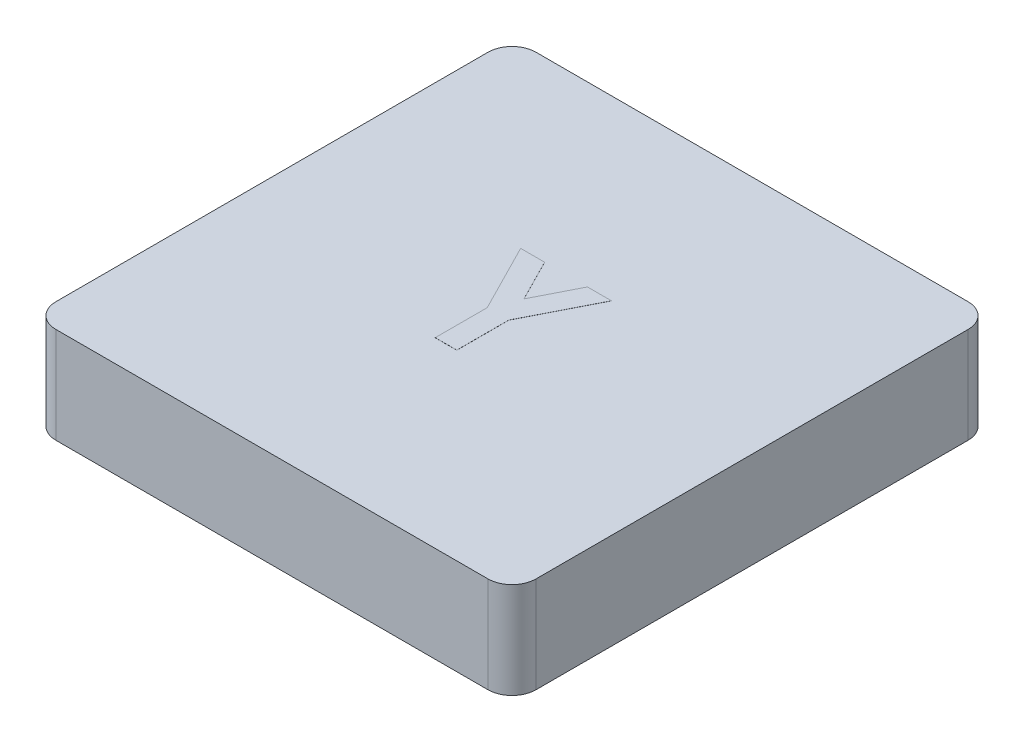
ISO-10303-21;
HEADER;
FILE_DESCRIPTION(('STEP AP214'),'2;1');
FILE_NAME('part.step','',(''),(''),'','','');
FILE_SCHEMA(('AUTOMOTIVE_DESIGN { 1 0 10303 214 1 1 1 1 }'));
ENDSEC;
DATA;
#1=APPLICATION_CONTEXT('core data for automotive mechanical design processes');
#2=APPLICATION_PROTOCOL_DEFINITION('international standard','automotive_design',2000,#1);
#3=PRODUCT_CONTEXT('',#1,'mechanical');
#4=PRODUCT('Part','Part','',(#3));
#5=PRODUCT_RELATED_PRODUCT_CATEGORY('part','',(#4));
#6=PRODUCT_DEFINITION_FORMATION('','',#4);
#7=PRODUCT_DEFINITION_CONTEXT('part definition',#1,'design');
#8=PRODUCT_DEFINITION('design','',#6,#7);
#9=PRODUCT_DEFINITION_SHAPE('','',#8);
#10=(LENGTH_UNIT() NAMED_UNIT(*) SI_UNIT(.MILLI.,.METRE.));
#11=(NAMED_UNIT(*) PLANE_ANGLE_UNIT() SI_UNIT($,.RADIAN.));
#12=(NAMED_UNIT(*) SI_UNIT($,.STERADIAN.) SOLID_ANGLE_UNIT());
#13=UNCERTAINTY_MEASURE_WITH_UNIT(LENGTH_MEASURE(1.E-05),#10,'distance_accuracy_value','');
#14=(GEOMETRIC_REPRESENTATION_CONTEXT(3) GLOBAL_UNCERTAINTY_ASSIGNED_CONTEXT((#13)) GLOBAL_UNIT_ASSIGNED_CONTEXT((#10,
#11,#12)) REPRESENTATION_CONTEXT('',''));
#15=CARTESIAN_POINT('',(0.,0.,0.));
#16=DIRECTION('',(0.,0.,1.));
#17=DIRECTION('',(1.,0.,0.));
#18=AXIS2_PLACEMENT_3D('',#15,#16,#17);
#19=CARTESIAN_POINT('',(0.,2.54,-12.7));
#20=DIRECTION('',(1.,0.,0.));
#21=DIRECTION('',(0.,0.,-1.));
#22=AXIS2_PLACEMENT_3D('',#19,#20,#21);
#23=PLANE('',#22);
#24=DIRECTION('',(0.,0.,1.));
#25=VECTOR('',#24,1.);
#26=CARTESIAN_POINT('',(0.,2.54,-12.7));
#27=LINE('',#26,#25);
#28=CARTESIAN_POINT('',(0.,2.54,-12.065));
#29=VERTEX_POINT('',#28);
#30=CARTESIAN_POINT('',(0.,2.54,-0.635));
#31=VERTEX_POINT('',#30);
#32=EDGE_CURVE('E294',#29,#31,#27,.T.);
#33=ORIENTED_EDGE('',*,*,#32,.F.);
#34=DIRECTION('',(0.,-1.,0.));
#35=VECTOR('',#34,1.);
#36=CARTESIAN_POINT('',(0.,2.54,-12.065));
#37=LINE('',#36,#35);
#38=CARTESIAN_POINT('',(0.,0.,-12.065));
#39=VERTEX_POINT('',#38);
#40=EDGE_CURVE('E319',#29,#39,#37,.T.);
#41=ORIENTED_EDGE('',*,*,#40,.T.);
#42=DIRECTION('',(0.,0.,1.));
#43=VECTOR('',#42,1.);
#44=CARTESIAN_POINT('',(0.,0.,-12.7));
#45=LINE('',#44,#43);
#46=CARTESIAN_POINT('',(0.,0.,-0.635));
#47=VERTEX_POINT('',#46);
#48=EDGE_CURVE('E274',#39,#47,#45,.T.);
#49=ORIENTED_EDGE('',*,*,#48,.T.);
#50=DIRECTION('',(0.,-1.,0.));
#51=VECTOR('',#50,1.);
#52=CARTESIAN_POINT('',(0.,2.54,-0.635));
#53=LINE('',#52,#51);
#54=EDGE_CURVE('E307',#47,#31,#53,.F.);
#55=ORIENTED_EDGE('',*,*,#54,.T.);
#56=EDGE_LOOP('',(#33,#41,#49,#55));
#57=FACE_BOUND('',#56,.T.);
#58=ADVANCED_FACE('F33',(#57),#23,.F.);
#59=CARTESIAN_POINT('',(0.,2.54,0.));
#60=DIRECTION('',(0.,0.,-1.));
#61=DIRECTION('',(-1.,0.,0.));
#62=AXIS2_PLACEMENT_3D('',#59,#60,#61);
#63=PLANE('',#62);
#64=DIRECTION('',(1.,0.,0.));
#65=VECTOR('',#64,1.);
#66=CARTESIAN_POINT('',(0.,0.,0.));
#67=LINE('',#66,#65);
#68=CARTESIAN_POINT('',(0.635,0.,0.));
#69=VERTEX_POINT('',#68);
#70=CARTESIAN_POINT('',(12.065,0.,0.));
#71=VERTEX_POINT('',#70);
#72=EDGE_CURVE('E310',#69,#71,#67,.T.);
#73=ORIENTED_EDGE('',*,*,#72,.T.);
#74=DIRECTION('',(0.,-1.,0.));
#75=VECTOR('',#74,1.);
#76=CARTESIAN_POINT('',(12.065,2.54,0.));
#77=LINE('',#76,#75);
#78=CARTESIAN_POINT('',(12.065,2.54,0.));
#79=VERTEX_POINT('',#78);
#80=EDGE_CURVE('E41',#71,#79,#77,.F.);
#81=ORIENTED_EDGE('',*,*,#80,.T.);
#82=DIRECTION('',(1.,0.,0.));
#83=VECTOR('',#82,1.);
#84=CARTESIAN_POINT('',(0.,2.54,0.));
#85=LINE('',#84,#83);
#86=CARTESIAN_POINT('',(0.635,2.54,0.));
#87=VERTEX_POINT('',#86);
#88=EDGE_CURVE('E297',#87,#79,#85,.T.);
#89=ORIENTED_EDGE('',*,*,#88,.F.);
#90=DIRECTION('',(0.,-1.,0.));
#91=VECTOR('',#90,1.);
#92=CARTESIAN_POINT('',(0.635,2.54,0.));
#93=LINE('',#92,#91);
#94=EDGE_CURVE('E348',#87,#69,#93,.T.);
#95=ORIENTED_EDGE('',*,*,#94,.T.);
#96=EDGE_LOOP('',(#73,#81,#89,#95));
#97=FACE_BOUND('',#96,.T.);
#98=ADVANCED_FACE('F353',(#97),#63,.F.);
#99=CARTESIAN_POINT('',(12.7,2.54,0.));
#100=DIRECTION('',(-1.,0.,0.));
#101=DIRECTION('',(0.,0.,1.));
#102=AXIS2_PLACEMENT_3D('',#99,#100,#101);
#103=PLANE('',#102);
#104=DIRECTION('',(0.,0.,-1.));
#105=VECTOR('',#104,1.);
#106=CARTESIAN_POINT('',(12.7,0.,0.));
#107=LINE('',#106,#105);
#108=CARTESIAN_POINT('',(12.7,0.,-0.635));
#109=VERTEX_POINT('',#108);
#110=CARTESIAN_POINT('',(12.7,0.,-12.065));
#111=VERTEX_POINT('',#110);
#112=EDGE_CURVE('E313',#109,#111,#107,.T.);
#113=ORIENTED_EDGE('',*,*,#112,.T.);
#114=DIRECTION('',(0.,-1.,0.));
#115=VECTOR('',#114,1.);
#116=CARTESIAN_POINT('',(12.7,2.54,-12.065));
#117=LINE('',#116,#115);
#118=CARTESIAN_POINT('',(12.7,2.54,-12.065));
#119=VERTEX_POINT('',#118);
#120=EDGE_CURVE('E346',#111,#119,#117,.F.);
#121=ORIENTED_EDGE('',*,*,#120,.T.);
#122=DIRECTION('',(0.,0.,-1.));
#123=VECTOR('',#122,1.);
#124=CARTESIAN_POINT('',(12.7,2.54,0.));
#125=LINE('',#124,#123);
#126=CARTESIAN_POINT('',(12.7,2.54,-0.635));
#127=VERTEX_POINT('',#126);
#128=EDGE_CURVE('E301',#127,#119,#125,.T.);
#129=ORIENTED_EDGE('',*,*,#128,.F.);
#130=DIRECTION('',(0.,-1.,0.));
#131=VECTOR('',#130,1.);
#132=CARTESIAN_POINT('',(12.7,2.54,-0.635));
#133=LINE('',#132,#131);
#134=EDGE_CURVE('E343',#127,#109,#133,.T.);
#135=ORIENTED_EDGE('',*,*,#134,.T.);
#136=EDGE_LOOP('',(#113,#121,#129,#135));
#137=FACE_BOUND('',#136,.T.);
#138=ADVANCED_FACE('F366',(#137),#103,.F.);
#139=CARTESIAN_POINT('',(12.7,2.54,-12.7));
#140=DIRECTION('',(0.,0.,1.));
#141=DIRECTION('',(1.,0.,0.));
#142=AXIS2_PLACEMENT_3D('',#139,#140,#141);
#143=PLANE('',#142);
#144=DIRECTION('',(-1.,0.,0.));
#145=VECTOR('',#144,1.);
#146=CARTESIAN_POINT('',(12.7,0.,-12.7));
#147=LINE('',#146,#145);
#148=CARTESIAN_POINT('',(12.065,0.,-12.7));
#149=VERTEX_POINT('',#148);
#150=CARTESIAN_POINT('',(0.634999999999995,0.,-12.7));
#151=VERTEX_POINT('',#150);
#152=EDGE_CURVE('E298',#149,#151,#147,.T.);
#153=ORIENTED_EDGE('',*,*,#152,.T.);
#154=DIRECTION('',(0.,-1.,0.));
#155=VECTOR('',#154,1.);
#156=CARTESIAN_POINT('',(0.634999999999995,2.54,-12.7));
#157=LINE('',#156,#155);
#158=CARTESIAN_POINT('',(0.634999999999995,2.54,-12.7));
#159=VERTEX_POINT('',#158);
#160=EDGE_CURVE('E333',#151,#159,#157,.F.);
#161=ORIENTED_EDGE('',*,*,#160,.T.);
#162=DIRECTION('',(-1.,0.,0.));
#163=VECTOR('',#162,1.);
#164=CARTESIAN_POINT('',(12.7,2.54,-12.7));
#165=LINE('',#164,#163);
#166=CARTESIAN_POINT('',(12.065,2.54,-12.7));
#167=VERTEX_POINT('',#166);
#168=EDGE_CURVE('E304',#167,#159,#165,.T.);
#169=ORIENTED_EDGE('',*,*,#168,.F.);
#170=DIRECTION('',(0.,-1.,0.));
#171=VECTOR('',#170,1.);
#172=CARTESIAN_POINT('',(12.065,2.54,-12.7));
#173=LINE('',#172,#171);
#174=EDGE_CURVE('E330',#167,#149,#173,.T.);
#175=ORIENTED_EDGE('',*,*,#174,.T.);
#176=EDGE_LOOP('',(#153,#161,#169,#175));
#177=FACE_BOUND('',#176,.T.);
#178=ADVANCED_FACE('F378',(#177),#143,.F.);
#179=CARTESIAN_POINT('',(0.,2.54,0.));
#180=DIRECTION('',(0.,1.,0.));
#181=DIRECTION('',(0.,0.,1.));
#182=AXIS2_PLACEMENT_3D('',#179,#180,#181);
#183=PLANE('',#182);
#184=DIRECTION('',(-0.453501133357851,0.,-0.891255699585223));
#185=VECTOR('',#184,1.);
#186=CARTESIAN_POINT('',(5.8436282051282,2.54,-6.20107011217949));
#187=LINE('',#186,#185);
#188=CARTESIAN_POINT('',(5.8436282051282,2.54,-6.20107011217949));
#189=VERTEX_POINT('',#188);
#190=CARTESIAN_POINT('',(4.92776282051282,2.54,-8.001));
#191=VERTEX_POINT('',#190);
#192=EDGE_CURVE('E221',#189,#191,#187,.T.);
#193=ORIENTED_EDGE('',*,*,#192,.T.);
#194=DIRECTION('',(1.,0.,0.));
#195=VECTOR('',#194,1.);
#196=CARTESIAN_POINT('',(4.92776282051282,2.54,-8.001));
#197=LINE('',#196,#195);
#198=CARTESIAN_POINT('',(5.56187239583333,2.54,-8.001));
#199=VERTEX_POINT('',#198);
#200=EDGE_CURVE('E181',#191,#199,#197,.T.);
#201=ORIENTED_EDGE('',*,*,#200,.T.);
#202=DIRECTION('',(0.453513991318912,0.,0.891249156901699));
#203=VECTOR('',#202,1.);
#204=CARTESIAN_POINT('',(5.56187239583333,2.54,-8.001));
#205=LINE('',#204,#203);
#206=CARTESIAN_POINT('',(6.1285641025641,2.54,-6.88733313301282));
#207=VERTEX_POINT('',#206);
#208=EDGE_CURVE('E224',#199,#207,#205,.T.);
#209=ORIENTED_EDGE('',*,*,#208,.T.);
#210=DIRECTION('',(0.453513991318911,0.,-0.8912491569017));
#211=VECTOR('',#210,1.);
#212=CARTESIAN_POINT('',(6.1285641025641,2.54,-6.88733313301282));
#213=LINE('',#212,#211);
#214=CARTESIAN_POINT('',(6.69525580929486,2.54,-8.001));
#215=VERTEX_POINT('',#214);
#216=EDGE_CURVE('E226',#207,#215,#213,.T.);
#217=ORIENTED_EDGE('',*,*,#216,.T.);
#218=DIRECTION('',(1.,0.,0.));
#219=VECTOR('',#218,1.);
#220=CARTESIAN_POINT('',(6.69525580929487,2.54,-8.001));
#221=LINE('',#220,#219);
#222=CARTESIAN_POINT('',(7.32936538461538,2.54,-8.001));
#223=VERTEX_POINT('',#222);
#224=EDGE_CURVE('E228',#215,#223,#221,.T.);
#225=ORIENTED_EDGE('',*,*,#224,.T.);
#226=DIRECTION('',(-0.453501133357852,0.,0.891255699585222));
#227=VECTOR('',#226,1.);
#228=CARTESIAN_POINT('',(7.32936538461538,2.54,-8.001));
#229=LINE('',#228,#227);
#230=CARTESIAN_POINT('',(6.4135,2.54,-6.20107011217949));
#231=VERTEX_POINT('',#230);
#232=EDGE_CURVE('E230',#223,#231,#229,.T.);
#233=ORIENTED_EDGE('',*,*,#232,.T.);
#234=DIRECTION('',(0.,0.,1.));
#235=VECTOR('',#234,1.);
#236=CARTESIAN_POINT('',(6.41349999999999,2.54,-6.20107011217949));
#237=LINE('',#236,#235);
#238=CARTESIAN_POINT('',(6.41349999999999,2.54,-4.826));
#239=VERTEX_POINT('',#238);
#240=EDGE_CURVE('E232',#231,#239,#237,.T.);
#241=ORIENTED_EDGE('',*,*,#240,.T.);
#242=DIRECTION('',(-1.,0.,0.));
#243=VECTOR('',#242,1.);
#244=CARTESIAN_POINT('',(6.41349999999999,2.54,-4.826));
#245=LINE('',#244,#243);
#246=CARTESIAN_POINT('',(5.8436282051282,2.54,-4.826));
#247=VERTEX_POINT('',#246);
#248=EDGE_CURVE('E53',#239,#247,#245,.T.);
#249=ORIENTED_EDGE('',*,*,#248,.T.);
#250=DIRECTION('',(0.,0.,-1.));
#251=VECTOR('',#250,1.);
#252=CARTESIAN_POINT('',(5.8436282051282,2.54,-4.826));
#253=LINE('',#252,#251);
#254=EDGE_CURVE('E48',#247,#189,#253,.T.);
#255=ORIENTED_EDGE('',*,*,#254,.T.);
#256=EDGE_LOOP('',(#193,#201,#209,#217,#225,#233,#241,#249,#255));
#257=FACE_BOUND('',#256,.T.);
#258=ORIENTED_EDGE('',*,*,#168,.T.);
#259=CARTESIAN_POINT('',(0.634999999999995,2.54,-12.065));
#260=DIRECTION('',(0.,1.,0.));
#261=DIRECTION('',(0.,0.,1.));
#262=AXIS2_PLACEMENT_3D('',#259,#260,#261);
#263=CIRCLE('',#262,0.635);
#264=EDGE_CURVE('E341',#159,#29,#263,.T.);
#265=ORIENTED_EDGE('',*,*,#264,.T.);
#266=ORIENTED_EDGE('',*,*,#32,.T.);
#267=CARTESIAN_POINT('',(0.635,2.54,-0.635));
#268=DIRECTION('',(0.,1.,0.));
#269=DIRECTION('',(0.,0.,1.));
#270=AXIS2_PLACEMENT_3D('',#267,#268,#269);
#271=CIRCLE('',#270,0.635);
#272=EDGE_CURVE('E335',#31,#87,#271,.T.);
#273=ORIENTED_EDGE('',*,*,#272,.T.);
#274=ORIENTED_EDGE('',*,*,#88,.T.);
#275=CARTESIAN_POINT('',(12.065,2.54,-0.635));
#276=DIRECTION('',(0.,1.,0.));
#277=DIRECTION('',(0.,0.,1.));
#278=AXIS2_PLACEMENT_3D('',#275,#276,#277);
#279=CIRCLE('',#278,0.635);
#280=EDGE_CURVE('E337',#79,#127,#279,.T.);
#281=ORIENTED_EDGE('',*,*,#280,.T.);
#282=ORIENTED_EDGE('',*,*,#128,.T.);
#283=CARTESIAN_POINT('',(12.065,2.54,-12.065));
#284=DIRECTION('',(0.,1.,0.));
#285=DIRECTION('',(0.,0.,1.));
#286=AXIS2_PLACEMENT_3D('',#283,#284,#285);
#287=CIRCLE('',#286,0.635);
#288=EDGE_CURVE('E339',#119,#167,#287,.T.);
#289=ORIENTED_EDGE('',*,*,#288,.T.);
#290=EDGE_LOOP('',(#258,#265,#266,#273,#274,#281,#282,#289));
#291=FACE_BOUND('',#290,.T.);
#292=ADVANCED_FACE('F359',(#257,#291),#183,.T.);
#293=CARTESIAN_POINT('',(0.,0.,0.));
#294=DIRECTION('',(0.,1.,0.));
#295=DIRECTION('',(0.,0.,1.));
#296=AXIS2_PLACEMENT_3D('',#293,#294,#295);
#297=PLANE('',#296);
#298=DIRECTION('',(-1.,0.,0.));
#299=VECTOR('',#298,1.);
#300=CARTESIAN_POINT('',(12.7,0.,-12.065));
#301=LINE('',#300,#299);
#302=CARTESIAN_POINT('',(12.065,0.,-12.065));
#303=VERTEX_POINT('',#302);
#304=CARTESIAN_POINT('',(0.634999999999995,0.,-12.065));
#305=VERTEX_POINT('',#304);
#306=EDGE_CURVE('E262',#303,#305,#301,.T.);
#307=ORIENTED_EDGE('',*,*,#306,.T.);
#308=DIRECTION('',(0.,0.,1.));
#309=VECTOR('',#308,1.);
#310=CARTESIAN_POINT('',(0.634999999999995,0.,-12.7));
#311=LINE('',#310,#309);
#312=CARTESIAN_POINT('',(0.635,0.,-0.635));
#313=VERTEX_POINT('',#312);
#314=EDGE_CURVE('E257',#305,#313,#311,.T.);
#315=ORIENTED_EDGE('',*,*,#314,.T.);
#316=DIRECTION('',(1.,0.,0.));
#317=VECTOR('',#316,1.);
#318=CARTESIAN_POINT('',(0.,0.,-0.635));
#319=LINE('',#318,#317);
#320=CARTESIAN_POINT('',(12.065,0.,-0.635));
#321=VERTEX_POINT('',#320);
#322=EDGE_CURVE('E286',#313,#321,#319,.T.);
#323=ORIENTED_EDGE('',*,*,#322,.T.);
#324=DIRECTION('',(0.,0.,-1.));
#325=VECTOR('',#324,1.);
#326=CARTESIAN_POINT('',(12.065,0.,0.));
#327=LINE('',#326,#325);
#328=EDGE_CURVE('E289',#321,#303,#327,.T.);
#329=ORIENTED_EDGE('',*,*,#328,.T.);
#330=EDGE_LOOP('',(#307,#315,#323,#329));
#331=FACE_BOUND('',#330,.T.);
#332=ORIENTED_EDGE('',*,*,#48,.F.);
#333=CARTESIAN_POINT('',(0.634999999999995,0.,-12.065));
#334=DIRECTION('',(0.,1.,0.));
#335=DIRECTION('',(0.,0.,1.));
#336=AXIS2_PLACEMENT_3D('',#333,#334,#335);
#337=CIRCLE('',#336,0.635);
#338=EDGE_CURVE('E328',#39,#151,#337,.F.);
#339=ORIENTED_EDGE('',*,*,#338,.T.);
#340=ORIENTED_EDGE('',*,*,#152,.F.);
#341=CARTESIAN_POINT('',(12.065,0.,-12.065));
#342=DIRECTION('',(0.,1.,0.));
#343=DIRECTION('',(0.,0.,1.));
#344=AXIS2_PLACEMENT_3D('',#341,#342,#343);
#345=CIRCLE('',#344,0.635);
#346=EDGE_CURVE('E326',#149,#111,#345,.F.);
#347=ORIENTED_EDGE('',*,*,#346,.T.);
#348=ORIENTED_EDGE('',*,*,#112,.F.);
#349=CARTESIAN_POINT('',(12.065,0.,-0.635));
#350=DIRECTION('',(0.,1.,0.));
#351=DIRECTION('',(0.,0.,1.));
#352=AXIS2_PLACEMENT_3D('',#349,#350,#351);
#353=CIRCLE('',#352,0.635);
#354=EDGE_CURVE('E324',#109,#71,#353,.F.);
#355=ORIENTED_EDGE('',*,*,#354,.T.);
#356=ORIENTED_EDGE('',*,*,#72,.F.);
#357=CARTESIAN_POINT('',(0.635,0.,-0.635));
#358=DIRECTION('',(0.,1.,0.));
#359=DIRECTION('',(0.,0.,1.));
#360=AXIS2_PLACEMENT_3D('',#357,#358,#359);
#361=CIRCLE('',#360,0.635);
#362=EDGE_CURVE('E322',#69,#47,#361,.F.);
#363=ORIENTED_EDGE('',*,*,#362,.T.);
#364=EDGE_LOOP('',(#332,#339,#340,#347,#348,#355,#356,#363));
#365=FACE_BOUND('',#364,.T.);
#366=ADVANCED_FACE('F370',(#331,#365),#297,.F.);
#367=CARTESIAN_POINT('',(0.634999999999995,2.54,-12.065));
#368=DIRECTION('',(0.,-1.,0.));
#369=DIRECTION('',(0.,0.,-1.));
#370=AXIS2_PLACEMENT_3D('',#367,#368,#369);
#371=CYLINDRICAL_SURFACE('',#370,0.635);
#372=ORIENTED_EDGE('',*,*,#264,.F.);
#373=ORIENTED_EDGE('',*,*,#160,.F.);
#374=ORIENTED_EDGE('',*,*,#338,.F.);
#375=ORIENTED_EDGE('',*,*,#40,.F.);
#376=EDGE_LOOP('',(#372,#373,#374,#375));
#377=FACE_BOUND('',#376,.T.);
#378=ADVANCED_FACE('F384',(#377),#371,.T.);
#379=CARTESIAN_POINT('',(12.065,2.54,-12.065));
#380=DIRECTION('',(0.,-1.,0.));
#381=DIRECTION('',(0.,0.,-1.));
#382=AXIS2_PLACEMENT_3D('',#379,#380,#381);
#383=CYLINDRICAL_SURFACE('',#382,0.635);
#384=ORIENTED_EDGE('',*,*,#288,.F.);
#385=ORIENTED_EDGE('',*,*,#120,.F.);
#386=ORIENTED_EDGE('',*,*,#346,.F.);
#387=ORIENTED_EDGE('',*,*,#174,.F.);
#388=EDGE_LOOP('',(#384,#385,#386,#387));
#389=FACE_BOUND('',#388,.T.);
#390=ADVANCED_FACE('F375',(#389),#383,.T.);
#391=CARTESIAN_POINT('',(12.065,2.54,-0.635));
#392=DIRECTION('',(0.,-1.,0.));
#393=DIRECTION('',(0.,0.,-1.));
#394=AXIS2_PLACEMENT_3D('',#391,#392,#393);
#395=CYLINDRICAL_SURFACE('',#394,0.635);
#396=ORIENTED_EDGE('',*,*,#280,.F.);
#397=ORIENTED_EDGE('',*,*,#80,.F.);
#398=ORIENTED_EDGE('',*,*,#354,.F.);
#399=ORIENTED_EDGE('',*,*,#134,.F.);
#400=EDGE_LOOP('',(#396,#397,#398,#399));
#401=FACE_BOUND('',#400,.T.);
#402=ADVANCED_FACE('F363',(#401),#395,.T.);
#403=CARTESIAN_POINT('',(0.635,2.54,-0.635));
#404=DIRECTION('',(0.,-1.,0.));
#405=DIRECTION('',(0.,0.,-1.));
#406=AXIS2_PLACEMENT_3D('',#403,#404,#405);
#407=CYLINDRICAL_SURFACE('',#406,0.635);
#408=ORIENTED_EDGE('',*,*,#272,.F.);
#409=ORIENTED_EDGE('',*,*,#54,.F.);
#410=ORIENTED_EDGE('',*,*,#362,.F.);
#411=ORIENTED_EDGE('',*,*,#94,.F.);
#412=EDGE_LOOP('',(#408,#409,#410,#411));
#413=FACE_BOUND('',#412,.T.);
#414=ADVANCED_FACE('F35',(#413),#407,.T.);
#415=CARTESIAN_POINT('',(0.634999999999995,2.54,-12.7));
#416=DIRECTION('',(1.,0.,0.));
#417=DIRECTION('',(0.,0.,-1.));
#418=AXIS2_PLACEMENT_3D('',#415,#416,#417);
#419=PLANE('',#418);
#420=DIRECTION('',(0.,0.,1.));
#421=VECTOR('',#420,1.);
#422=CARTESIAN_POINT('',(0.634999999999995,1.905,-12.7));
#423=LINE('',#422,#421);
#424=CARTESIAN_POINT('',(0.634999999999995,1.905,-12.065));
#425=VERTEX_POINT('',#424);
#426=CARTESIAN_POINT('',(0.635,1.905,-0.635));
#427=VERTEX_POINT('',#426);
#428=EDGE_CURVE('E258',#425,#427,#423,.T.);
#429=ORIENTED_EDGE('',*,*,#428,.T.);
#430=DIRECTION('',(0.,1.,0.));
#431=VECTOR('',#430,1.);
#432=CARTESIAN_POINT('',(0.635,2.54,-0.635));
#433=LINE('',#432,#431);
#434=EDGE_CURVE('E267',#313,#427,#433,.T.);
#435=ORIENTED_EDGE('',*,*,#434,.F.);
#436=ORIENTED_EDGE('',*,*,#314,.F.);
#437=DIRECTION('',(0.,1.,0.));
#438=VECTOR('',#437,1.);
#439=CARTESIAN_POINT('',(0.634999999999995,2.54,-12.065));
#440=LINE('',#439,#438);
#441=EDGE_CURVE('E263',#305,#425,#440,.T.);
#442=ORIENTED_EDGE('',*,*,#441,.T.);
#443=EDGE_LOOP('',(#429,#435,#436,#442));
#444=FACE_BOUND('',#443,.T.);
#445=ADVANCED_FACE('F389',(#444),#419,.T.);
#446=CARTESIAN_POINT('',(0.,2.54,-0.635));
#447=DIRECTION('',(0.,0.,-1.));
#448=DIRECTION('',(-1.,0.,0.));
#449=AXIS2_PLACEMENT_3D('',#446,#447,#448);
#450=PLANE('',#449);
#451=ORIENTED_EDGE('',*,*,#322,.F.);
#452=ORIENTED_EDGE('',*,*,#434,.T.);
#453=DIRECTION('',(1.,0.,0.));
#454=VECTOR('',#453,1.);
#455=CARTESIAN_POINT('',(0.,1.905,-0.635));
#456=LINE('',#455,#454);
#457=CARTESIAN_POINT('',(12.065,1.905,-0.635));
#458=VERTEX_POINT('',#457);
#459=EDGE_CURVE('E261',#427,#458,#456,.T.);
#460=ORIENTED_EDGE('',*,*,#459,.T.);
#461=DIRECTION('',(0.,1.,0.));
#462=VECTOR('',#461,1.);
#463=CARTESIAN_POINT('',(12.065,2.54,-0.635));
#464=LINE('',#463,#462);
#465=EDGE_CURVE('E271',#321,#458,#464,.T.);
#466=ORIENTED_EDGE('',*,*,#465,.F.);
#467=EDGE_LOOP('',(#451,#452,#460,#466));
#468=FACE_BOUND('',#467,.T.);
#469=ADVANCED_FACE('F394',(#468),#450,.T.);
#470=CARTESIAN_POINT('',(12.065,2.54,0.));
#471=DIRECTION('',(-1.,0.,0.));
#472=DIRECTION('',(0.,0.,1.));
#473=AXIS2_PLACEMENT_3D('',#470,#471,#472);
#474=PLANE('',#473);
#475=ORIENTED_EDGE('',*,*,#328,.F.);
#476=ORIENTED_EDGE('',*,*,#465,.T.);
#477=DIRECTION('',(0.,0.,-1.));
#478=VECTOR('',#477,1.);
#479=CARTESIAN_POINT('',(12.065,1.905,0.));
#480=LINE('',#479,#478);
#481=CARTESIAN_POINT('',(12.065,1.905,-12.065));
#482=VERTEX_POINT('',#481);
#483=EDGE_CURVE('E277',#458,#482,#480,.T.);
#484=ORIENTED_EDGE('',*,*,#483,.T.);
#485=DIRECTION('',(0.,1.,0.));
#486=VECTOR('',#485,1.);
#487=CARTESIAN_POINT('',(12.065,2.54,-12.065));
#488=LINE('',#487,#486);
#489=EDGE_CURVE('E266',#303,#482,#488,.T.);
#490=ORIENTED_EDGE('',*,*,#489,.F.);
#491=EDGE_LOOP('',(#475,#476,#484,#490));
#492=FACE_BOUND('',#491,.T.);
#493=ADVANCED_FACE('F447',(#492),#474,.T.);
#494=CARTESIAN_POINT('',(12.7,2.54,-12.065));
#495=DIRECTION('',(0.,0.,1.));
#496=DIRECTION('',(1.,0.,0.));
#497=AXIS2_PLACEMENT_3D('',#494,#495,#496);
#498=PLANE('',#497);
#499=ORIENTED_EDGE('',*,*,#306,.F.);
#500=ORIENTED_EDGE('',*,*,#489,.T.);
#501=DIRECTION('',(-1.,0.,0.));
#502=VECTOR('',#501,1.);
#503=CARTESIAN_POINT('',(12.7,1.905,-12.065));
#504=LINE('',#503,#502);
#505=EDGE_CURVE('E270',#482,#425,#504,.T.);
#506=ORIENTED_EDGE('',*,*,#505,.T.);
#507=ORIENTED_EDGE('',*,*,#441,.F.);
#508=EDGE_LOOP('',(#499,#500,#506,#507));
#509=FACE_BOUND('',#508,.T.);
#510=ADVANCED_FACE('F457',(#509),#498,.T.);
#511=CARTESIAN_POINT('',(0.,1.905,0.));
#512=DIRECTION('',(0.,1.,0.));
#513=DIRECTION('',(0.,0.,1.));
#514=AXIS2_PLACEMENT_3D('',#511,#512,#513);
#515=PLANE('',#514);
#516=CARTESIAN_POINT('',(6.34999999999999,1.905,-6.35));
#517=DIRECTION('',(0.,1.,0.));
#518=DIRECTION('',(0.,0.,1.));
#519=AXIS2_PLACEMENT_3D('',#516,#517,#518);
#520=CIRCLE('',#519,2.54);
#521=CARTESIAN_POINT('',(6.34999999999999,1.905,-3.81));
#522=VERTEX_POINT('',#521);
#523=EDGE_CURVE('E11',#522,#522,#520,.F.);
#524=ORIENTED_EDGE('',*,*,#523,.F.);
#525=EDGE_LOOP('',(#524));
#526=FACE_BOUND('',#525,.T.);
#527=ORIENTED_EDGE('',*,*,#505,.F.);
#528=ORIENTED_EDGE('',*,*,#483,.F.);
#529=ORIENTED_EDGE('',*,*,#459,.F.);
#530=ORIENTED_EDGE('',*,*,#428,.F.);
#531=EDGE_LOOP('',(#527,#528,#529,#530));
#532=FACE_BOUND('',#531,.T.);
#533=ADVANCED_FACE('F467',(#526,#532),#515,.F.);
#534=CARTESIAN_POINT('',(6.34999999999999,-7.18420489685532,-6.35));
#535=DIRECTION('',(0.,1.,0.));
#536=DIRECTION('',(0.,0.,1.));
#537=AXIS2_PLACEMENT_3D('',#534,#535,#536);
#538=CYLINDRICAL_SURFACE('',#537,2.54);
#539=CARTESIAN_POINT('',(6.34999999999999,0.,-6.35));
#540=DIRECTION('',(0.,1.,0.));
#541=DIRECTION('',(0.,0.,1.));
#542=AXIS2_PLACEMENT_3D('',#539,#540,#541);
#543=CIRCLE('',#542,2.54);
#544=CARTESIAN_POINT('',(6.34999999999999,0.,-3.81));
#545=VERTEX_POINT('',#544);
#546=EDGE_CURVE('E236',#545,#545,#543,.T.);
#547=CARTESIAN_POINT('',(6.34999999999999,0.,-3.81));
#548=CARTESIAN_POINT('',(6.34999999999999,0.0198437499999991,-3.81));
#549=CARTESIAN_POINT('',(6.34999999999999,0.0396874999999989,-3.81));
#550=CARTESIAN_POINT('',(6.34999999999999,0.079374999999999,-3.81));
#551=CARTESIAN_POINT('',(6.34999999999999,0.0992187499999992,-3.81));
#552=CARTESIAN_POINT('',(6.34999999999999,0.138906249999999,-3.81));
#553=CARTESIAN_POINT('',(6.34999999999999,0.158749999999999,-3.81));
#554=CARTESIAN_POINT('',(6.34999999999999,0.198437499999999,-3.81));
#555=CARTESIAN_POINT('',(6.34999999999999,0.218281249999999,-3.81));
#556=CARTESIAN_POINT('',(6.34999999999999,0.25796875,-3.81));
#557=CARTESIAN_POINT('',(6.34999999999999,0.277812499999999,-3.81));
#558=CARTESIAN_POINT('',(6.34999999999999,0.317499999999999,-3.81));
#559=CARTESIAN_POINT('',(6.34999999999999,0.337343749999999,-3.81));
#560=CARTESIAN_POINT('',(6.34999999999999,0.377031249999999,-3.81));
#561=CARTESIAN_POINT('',(6.34999999999999,0.396874999999999,-3.81));
#562=CARTESIAN_POINT('',(6.34999999999999,0.436562499999999,-3.81));
#563=CARTESIAN_POINT('',(6.34999999999999,0.456406249999999,-3.81));
#564=CARTESIAN_POINT('',(6.34999999999999,0.496093749999999,-3.81));
#565=CARTESIAN_POINT('',(6.34999999999999,0.515937499999999,-3.81));
#566=CARTESIAN_POINT('',(6.34999999999999,0.555624999999999,-3.81));
#567=CARTESIAN_POINT('',(6.34999999999999,0.575468749999999,-3.81));
#568=CARTESIAN_POINT('',(6.34999999999999,0.615156249999999,-3.81));
#569=CARTESIAN_POINT('',(6.34999999999999,0.634999999999999,-3.81));
#570=CARTESIAN_POINT('',(6.34999999999999,0.674687499999998,-3.81));
#571=CARTESIAN_POINT('',(6.34999999999999,0.694531249999998,-3.81));
#572=CARTESIAN_POINT('',(6.34999999999999,0.734218749999998,-3.81));
#573=CARTESIAN_POINT('',(6.34999999999999,0.754062499999998,-3.81));
#574=CARTESIAN_POINT('',(6.34999999999999,0.793749999999998,-3.81));
#575=CARTESIAN_POINT('',(6.34999999999999,0.813593749999999,-3.81));
#576=CARTESIAN_POINT('',(6.34999999999999,0.853281249999999,-3.81));
#577=CARTESIAN_POINT('',(6.34999999999999,0.873124999999999,-3.81));
#578=CARTESIAN_POINT('',(6.34999999999999,0.912812499999999,-3.81));
#579=CARTESIAN_POINT('',(6.34999999999999,0.932656249999999,-3.81));
#580=CARTESIAN_POINT('',(6.34999999999999,0.972343749999998,-3.81));
#581=CARTESIAN_POINT('',(6.34999999999999,0.992187499999998,-3.81));
#582=CARTESIAN_POINT('',(6.34999999999999,1.031875,-3.81));
#583=CARTESIAN_POINT('',(6.34999999999999,1.05171875,-3.81));
#584=CARTESIAN_POINT('',(6.34999999999999,1.09140625,-3.81));
#585=CARTESIAN_POINT('',(6.34999999999999,1.11125,-3.81));
#586=CARTESIAN_POINT('',(6.34999999999999,1.1509375,-3.81));
#587=CARTESIAN_POINT('',(6.34999999999999,1.17078125,-3.81));
#588=CARTESIAN_POINT('',(6.34999999999999,1.21046875,-3.81));
#589=CARTESIAN_POINT('',(6.34999999999999,1.2303125,-3.81));
#590=CARTESIAN_POINT('',(6.34999999999999,1.27,-3.81));
#591=CARTESIAN_POINT('',(6.34999999999999,1.28984375,-3.81));
#592=CARTESIAN_POINT('',(6.34999999999999,1.32953125,-3.81));
#593=CARTESIAN_POINT('',(6.34999999999999,1.349375,-3.81));
#594=CARTESIAN_POINT('',(6.34999999999999,1.3890625,-3.81));
#595=CARTESIAN_POINT('',(6.34999999999999,1.40890625,-3.81));
#596=CARTESIAN_POINT('',(6.34999999999999,1.44859375,-3.81));
#597=CARTESIAN_POINT('',(6.34999999999999,1.4684375,-3.81));
#598=CARTESIAN_POINT('',(6.34999999999999,1.508125,-3.81));
#599=CARTESIAN_POINT('',(6.34999999999999,1.52796875,-3.81));
#600=CARTESIAN_POINT('',(6.34999999999999,1.56765625,-3.81));
#601=CARTESIAN_POINT('',(6.34999999999999,1.5875,-3.81));
#602=CARTESIAN_POINT('',(6.34999999999999,1.6271875,-3.81));
#603=CARTESIAN_POINT('',(6.34999999999999,1.64703125,-3.81));
#604=CARTESIAN_POINT('',(6.34999999999999,1.68671875,-3.81));
#605=CARTESIAN_POINT('',(6.34999999999999,1.7065625,-3.81));
#606=CARTESIAN_POINT('',(6.34999999999999,1.74625,-3.81));
#607=CARTESIAN_POINT('',(6.34999999999999,1.76609375,-3.81));
#608=CARTESIAN_POINT('',(6.34999999999999,1.80578125,-3.81));
#609=CARTESIAN_POINT('',(6.34999999999999,1.825625,-3.81));
#610=CARTESIAN_POINT('',(6.34999999999999,1.8653125,-3.81));
#611=CARTESIAN_POINT('',(6.34999999999999,1.88515625,-3.81));
#612=CARTESIAN_POINT('',(6.34999999999999,1.905,-3.81));
#613=B_SPLINE_CURVE_WITH_KNOTS('',3,(#547,#548,#549,#550,#551,#552,#553,#554,#555,#556,#557,
#558,#559,#560,#561,#562,#563,#564,#565,#566,#567,#568,#569,#570,#571,#572,#573,#574,#575,#576,
#577,#578,#579,#580,#581,#582,#583,#584,#585,#586,#587,#588,#589,#590,#591,#592,#593,#594,#595,
#596,#597,#598,#599,#600,#601,#602,#603,#604,#605,#606,#607,#608,#609,#610,#611,#612),
.UNSPECIFIED.,.F.,.F.,(4,2,2,2,2,2,2,2,2,2,2,2,2,2,2,2,2,2,2,2,2,2,2,2,2,2,2,2,2,2,2,2,4),(0.,
0.0595312499999997,0.1190625,0.17859375,0.238125,0.29765625,0.3571875,0.41671875,0.47625,
0.53578125,0.5953125,0.654843749999999,0.714374999999999,0.773906249999999,0.8334375,0.89296875,
0.952499999999999,1.01203125,1.0715625,1.13109375,1.190625,1.25015625,1.3096875,1.36921875,
1.42875,1.48828125,1.5478125,1.60734375,1.666875,1.72640625,1.7859375,1.84546875,1.905),.UNSPECIFIED.);
#614=EDGE_CURVE('BSEAM477',#545,#522,#613,.T.);
#615=ORIENTED_EDGE('',*,*,#546,.T.);
#616=ORIENTED_EDGE('',*,*,#523,.T.);
#617=ORIENTED_EDGE('',*,*,#614,.T.);
#618=ORIENTED_EDGE('',*,*,#614,.F.);
#619=EDGE_LOOP('',(#615,#617,#616,#618));
#620=FACE_BOUND('',#619,.T.);
#621=ADVANCED_FACE('F477',(#620),#538,.T.);
#622=CARTESIAN_POINT('',(0.,0.,0.));
#623=DIRECTION('',(0.,1.,0.));
#624=DIRECTION('',(0.,0.,1.));
#625=AXIS2_PLACEMENT_3D('',#622,#623,#624);
#626=PLANE('',#625);
#627=ORIENTED_EDGE('',*,*,#546,.F.);
#628=EDGE_LOOP('',(#627));
#629=FACE_BOUND('',#628,.T.);
#630=ADVANCED_FACE('F487',(#629),#626,.F.);
#631=CARTESIAN_POINT('',(5.8436282051282,2.54254,-6.20107011217949));
#632=DIRECTION('',(-0.891255699585223,0.,0.453501133357851));
#633=DIRECTION('',(0.453501133357851,0.,0.891255699585223));
#634=AXIS2_PLACEMENT_3D('',#631,#632,#633);
#635=PLANE('',#634);
#636=ORIENTED_EDGE('',*,*,#192,.F.);
#637=DIRECTION('',(0.,-1.,0.));
#638=VECTOR('',#637,1.);
#639=CARTESIAN_POINT('',(5.8436282051282,2.54254,-6.20107011217949));
#640=LINE('',#639,#638);
#641=CARTESIAN_POINT('',(5.8436282051282,2.54254,-6.20107011217949));
#642=VERTEX_POINT('',#641);
#643=EDGE_CURVE('E200',#642,#189,#640,.T.);
#644=ORIENTED_EDGE('',*,*,#643,.F.);
#645=DIRECTION('',(-0.453501133357851,0.,-0.891255699585223));
#646=VECTOR('',#645,1.);
#647=CARTESIAN_POINT('',(5.8436282051282,2.54254,-6.20107011217949));
#648=LINE('',#647,#646);
#649=CARTESIAN_POINT('',(4.92776282051282,2.54254,-8.001));
#650=VERTEX_POINT('',#649);
#651=EDGE_CURVE('E193',#642,#650,#648,.T.);
#652=ORIENTED_EDGE('',*,*,#651,.T.);
#653=DIRECTION('',(0.,-1.,0.));
#654=VECTOR('',#653,1.);
#655=CARTESIAN_POINT('',(4.92776282051282,2.54254,-8.001));
#656=LINE('',#655,#654);
#657=EDGE_CURVE('E176',#650,#191,#656,.T.);
#658=ORIENTED_EDGE('',*,*,#657,.T.);
#659=EDGE_LOOP('',(#636,#644,#652,#658));
#660=FACE_BOUND('',#659,.T.);
#661=ADVANCED_FACE('F199',(#660),#635,.T.);
#662=CARTESIAN_POINT('',(5.8436282051282,2.54254,-4.826));
#663=DIRECTION('',(-1.,0.,0.));
#664=DIRECTION('',(0.,0.,1.));
#665=AXIS2_PLACEMENT_3D('',#662,#663,#664);
#666=PLANE('',#665);
#667=ORIENTED_EDGE('',*,*,#254,.F.);
#668=DIRECTION('',(0.,-1.,0.));
#669=VECTOR('',#668,1.);
#670=CARTESIAN_POINT('',(5.8436282051282,2.54254,-4.826));
#671=LINE('',#670,#669);
#672=CARTESIAN_POINT('',(5.8436282051282,2.54254,-4.826));
#673=VERTEX_POINT('',#672);
#674=EDGE_CURVE('E237',#673,#247,#671,.T.);
#675=ORIENTED_EDGE('',*,*,#674,.F.);
#676=DIRECTION('',(0.,0.,-1.));
#677=VECTOR('',#676,1.);
#678=CARTESIAN_POINT('',(5.8436282051282,2.54254,-4.826));
#679=LINE('',#678,#677);
#680=EDGE_CURVE('E186',#673,#642,#679,.T.);
#681=ORIENTED_EDGE('',*,*,#680,.T.);
#682=ORIENTED_EDGE('',*,*,#643,.T.);
#683=EDGE_LOOP('',(#667,#675,#681,#682));
#684=FACE_BOUND('',#683,.T.);
#685=ADVANCED_FACE('F514',(#684),#666,.T.);
#686=CARTESIAN_POINT('',(6.41349999999999,2.54254,-4.826));
#687=DIRECTION('',(0.,0.,1.));
#688=DIRECTION('',(1.,0.,0.));
#689=AXIS2_PLACEMENT_3D('',#686,#687,#688);
#690=PLANE('',#689);
#691=ORIENTED_EDGE('',*,*,#248,.F.);
#692=DIRECTION('',(0.,-1.,0.));
#693=VECTOR('',#692,1.);
#694=CARTESIAN_POINT('',(6.41349999999999,2.54254,-4.826));
#695=LINE('',#694,#693);
#696=CARTESIAN_POINT('',(6.41349999999999,2.54254,-4.826));
#697=VERTEX_POINT('',#696);
#698=EDGE_CURVE('E239',#697,#239,#695,.T.);
#699=ORIENTED_EDGE('',*,*,#698,.F.);
#700=DIRECTION('',(-1.,0.,0.));
#701=VECTOR('',#700,1.);
#702=CARTESIAN_POINT('',(6.41349999999999,2.54254,-4.826));
#703=LINE('',#702,#701);
#704=EDGE_CURVE('E217',#697,#673,#703,.T.);
#705=ORIENTED_EDGE('',*,*,#704,.T.);
#706=ORIENTED_EDGE('',*,*,#674,.T.);
#707=EDGE_LOOP('',(#691,#699,#705,#706));
#708=FACE_BOUND('',#707,.T.);
#709=ADVANCED_FACE('F523',(#708),#690,.T.);
#710=CARTESIAN_POINT('',(6.41349999999999,2.54254,-6.20107011217949));
#711=DIRECTION('',(1.,0.,0.));
#712=DIRECTION('',(0.,0.,-1.));
#713=AXIS2_PLACEMENT_3D('',#710,#711,#712);
#714=PLANE('',#713);
#715=ORIENTED_EDGE('',*,*,#240,.F.);
#716=DIRECTION('',(0.,-1.,0.));
#717=VECTOR('',#716,1.);
#718=CARTESIAN_POINT('',(6.41349999999999,2.54254,-6.20107011217949));
#719=LINE('',#718,#717);
#720=CARTESIAN_POINT('',(6.41349999999999,2.54254,-6.20107011217949));
#721=VERTEX_POINT('',#720);
#722=EDGE_CURVE('E242',#721,#231,#719,.T.);
#723=ORIENTED_EDGE('',*,*,#722,.F.);
#724=DIRECTION('',(0.,0.,1.));
#725=VECTOR('',#724,1.);
#726=CARTESIAN_POINT('',(6.41349999999999,2.54254,-6.20107011217949));
#727=LINE('',#726,#725);
#728=EDGE_CURVE('E214',#721,#697,#727,.T.);
#729=ORIENTED_EDGE('',*,*,#728,.T.);
#730=ORIENTED_EDGE('',*,*,#698,.T.);
#731=EDGE_LOOP('',(#715,#723,#729,#730));
#732=FACE_BOUND('',#731,.T.);
#733=ADVANCED_FACE('F533',(#732),#714,.T.);
#734=CARTESIAN_POINT('',(7.32936538461538,2.54254,-8.001));
#735=DIRECTION('',(0.891255699585222,0.,0.453501133357852));
#736=DIRECTION('',(0.453501133357852,0.,-0.891255699585222));
#737=AXIS2_PLACEMENT_3D('',#734,#735,#736);
#738=PLANE('',#737);
#739=ORIENTED_EDGE('',*,*,#232,.F.);
#740=DIRECTION('',(0.,-1.,0.));
#741=VECTOR('',#740,1.);
#742=CARTESIAN_POINT('',(7.32936538461538,2.54254,-8.001));
#743=LINE('',#742,#741);
#744=CARTESIAN_POINT('',(7.32936538461538,2.54254,-8.001));
#745=VERTEX_POINT('',#744);
#746=EDGE_CURVE('E245',#745,#223,#743,.T.);
#747=ORIENTED_EDGE('',*,*,#746,.F.);
#748=DIRECTION('',(-0.453501133357852,0.,0.891255699585222));
#749=VECTOR('',#748,1.);
#750=CARTESIAN_POINT('',(7.32936538461538,2.54254,-8.001));
#751=LINE('',#750,#749);
#752=EDGE_CURVE('E211',#745,#721,#751,.T.);
#753=ORIENTED_EDGE('',*,*,#752,.T.);
#754=ORIENTED_EDGE('',*,*,#722,.T.);
#755=EDGE_LOOP('',(#739,#747,#753,#754));
#756=FACE_BOUND('',#755,.T.);
#757=ADVANCED_FACE('F543',(#756),#738,.T.);
#758=CARTESIAN_POINT('',(6.69525580929487,2.54254,-8.001));
#759=DIRECTION('',(0.,0.,-1.));
#760=DIRECTION('',(-1.,0.,0.));
#761=AXIS2_PLACEMENT_3D('',#758,#759,#760);
#762=PLANE('',#761);
#763=ORIENTED_EDGE('',*,*,#224,.F.);
#764=DIRECTION('',(0.,-1.,0.));
#765=VECTOR('',#764,1.);
#766=CARTESIAN_POINT('',(6.69525580929487,2.54254,-8.001));
#767=LINE('',#766,#765);
#768=CARTESIAN_POINT('',(6.69525580929487,2.54254,-8.001));
#769=VERTEX_POINT('',#768);
#770=EDGE_CURVE('E248',#769,#215,#767,.T.);
#771=ORIENTED_EDGE('',*,*,#770,.F.);
#772=DIRECTION('',(1.,0.,0.));
#773=VECTOR('',#772,1.);
#774=CARTESIAN_POINT('',(6.69525580929487,2.54254,-8.001));
#775=LINE('',#774,#773);
#776=EDGE_CURVE('E208',#769,#745,#775,.T.);
#777=ORIENTED_EDGE('',*,*,#776,.T.);
#778=ORIENTED_EDGE('',*,*,#746,.T.);
#779=EDGE_LOOP('',(#763,#771,#777,#778));
#780=FACE_BOUND('',#779,.T.);
#781=ADVANCED_FACE('F553',(#780),#762,.T.);
#782=CARTESIAN_POINT('',(6.1285641025641,2.54254,-6.88733313301282));
#783=DIRECTION('',(-0.8912491569017,0.,-0.453513991318911));
#784=DIRECTION('',(-0.453513991318911,0.,0.8912491569017));
#785=AXIS2_PLACEMENT_3D('',#782,#783,#784);
#786=PLANE('',#785);
#787=ORIENTED_EDGE('',*,*,#216,.F.);
#788=DIRECTION('',(0.,-1.,0.));
#789=VECTOR('',#788,1.);
#790=CARTESIAN_POINT('',(6.1285641025641,2.54254,-6.88733313301282));
#791=LINE('',#790,#789);
#792=CARTESIAN_POINT('',(6.1285641025641,2.54254,-6.88733313301282));
#793=VERTEX_POINT('',#792);
#794=EDGE_CURVE('E251',#793,#207,#791,.T.);
#795=ORIENTED_EDGE('',*,*,#794,.F.);
#796=DIRECTION('',(0.453513991318911,0.,-0.8912491569017));
#797=VECTOR('',#796,1.);
#798=CARTESIAN_POINT('',(6.1285641025641,2.54254,-6.88733313301282));
#799=LINE('',#798,#797);
#800=EDGE_CURVE('E205',#793,#769,#799,.T.);
#801=ORIENTED_EDGE('',*,*,#800,.T.);
#802=ORIENTED_EDGE('',*,*,#770,.T.);
#803=EDGE_LOOP('',(#787,#795,#801,#802));
#804=FACE_BOUND('',#803,.T.);
#805=ADVANCED_FACE('F563',(#804),#786,.T.);
#806=CARTESIAN_POINT('',(5.56187239583333,2.54254,-8.001));
#807=DIRECTION('',(0.891249156901699,0.,-0.453513991318912));
#808=DIRECTION('',(-0.453513991318912,0.,-0.891249156901699));
#809=AXIS2_PLACEMENT_3D('',#806,#807,#808);
#810=PLANE('',#809);
#811=ORIENTED_EDGE('',*,*,#208,.F.);
#812=DIRECTION('',(0.,-1.,0.));
#813=VECTOR('',#812,1.);
#814=CARTESIAN_POINT('',(5.56187239583333,2.54254,-8.001));
#815=LINE('',#814,#813);
#816=CARTESIAN_POINT('',(5.56187239583333,2.54254,-8.001));
#817=VERTEX_POINT('',#816);
#818=EDGE_CURVE('E185',#817,#199,#815,.T.);
#819=ORIENTED_EDGE('',*,*,#818,.F.);
#820=DIRECTION('',(0.453513991318912,0.,0.891249156901699));
#821=VECTOR('',#820,1.);
#822=CARTESIAN_POINT('',(5.56187239583333,2.54254,-8.001));
#823=LINE('',#822,#821);
#824=EDGE_CURVE('E197',#817,#793,#823,.T.);
#825=ORIENTED_EDGE('',*,*,#824,.T.);
#826=ORIENTED_EDGE('',*,*,#794,.T.);
#827=EDGE_LOOP('',(#811,#819,#825,#826));
#828=FACE_BOUND('',#827,.T.);
#829=ADVANCED_FACE('F573',(#828),#810,.T.);
#830=CARTESIAN_POINT('',(4.92776282051282,2.54254,-8.001));
#831=DIRECTION('',(0.,0.,-1.));
#832=DIRECTION('',(-1.,0.,0.));
#833=AXIS2_PLACEMENT_3D('',#830,#831,#832);
#834=PLANE('',#833);
#835=ORIENTED_EDGE('',*,*,#200,.F.);
#836=ORIENTED_EDGE('',*,*,#657,.F.);
#837=DIRECTION('',(1.,0.,0.));
#838=VECTOR('',#837,1.);
#839=CARTESIAN_POINT('',(4.92776282051282,2.54254,-8.001));
#840=LINE('',#839,#838);
#841=EDGE_CURVE('E180',#650,#817,#840,.T.);
#842=ORIENTED_EDGE('',*,*,#841,.T.);
#843=ORIENTED_EDGE('',*,*,#818,.T.);
#844=EDGE_LOOP('',(#835,#836,#842,#843));
#845=FACE_BOUND('',#844,.T.);
#846=ADVANCED_FACE('F178',(#845),#834,.T.);
#847=CARTESIAN_POINT('',(0.,2.54254,0.));
#848=DIRECTION('',(0.,-1.,0.));
#849=DIRECTION('',(0.,0.,-1.));
#850=AXIS2_PLACEMENT_3D('',#847,#848,#849);
#851=PLANE('',#850);
#852=ORIENTED_EDGE('',*,*,#651,.F.);
#853=ORIENTED_EDGE('',*,*,#680,.F.);
#854=ORIENTED_EDGE('',*,*,#704,.F.);
#855=ORIENTED_EDGE('',*,*,#728,.F.);
#856=ORIENTED_EDGE('',*,*,#752,.F.);
#857=ORIENTED_EDGE('',*,*,#776,.F.);
#858=ORIENTED_EDGE('',*,*,#800,.F.);
#859=ORIENTED_EDGE('',*,*,#824,.F.);
#860=ORIENTED_EDGE('',*,*,#841,.F.);
#861=EDGE_LOOP('',(#852,#853,#854,#855,#856,#857,#858,#859,#860));
#862=FACE_BOUND('',#861,.T.);
#863=ADVANCED_FACE('F191',(#862),#851,.F.);
#864=CLOSED_SHELL('',(#58,#98,#138,#178,#292,#366,#378,#390,#402,#414,#445,#469,#493,#510,#533,
#621,#630,#661,#685,#709,#733,#757,#781,#805,#829,#846,#863));
#865=MANIFOLD_SOLID_BREP('B2',#864);
#866=ADVANCED_BREP_SHAPE_REPRESENTATION('',(#18,#865),#14);
#867=SHAPE_DEFINITION_REPRESENTATION(#9,#866);
ENDSEC;
END-ISO-10303-21;
